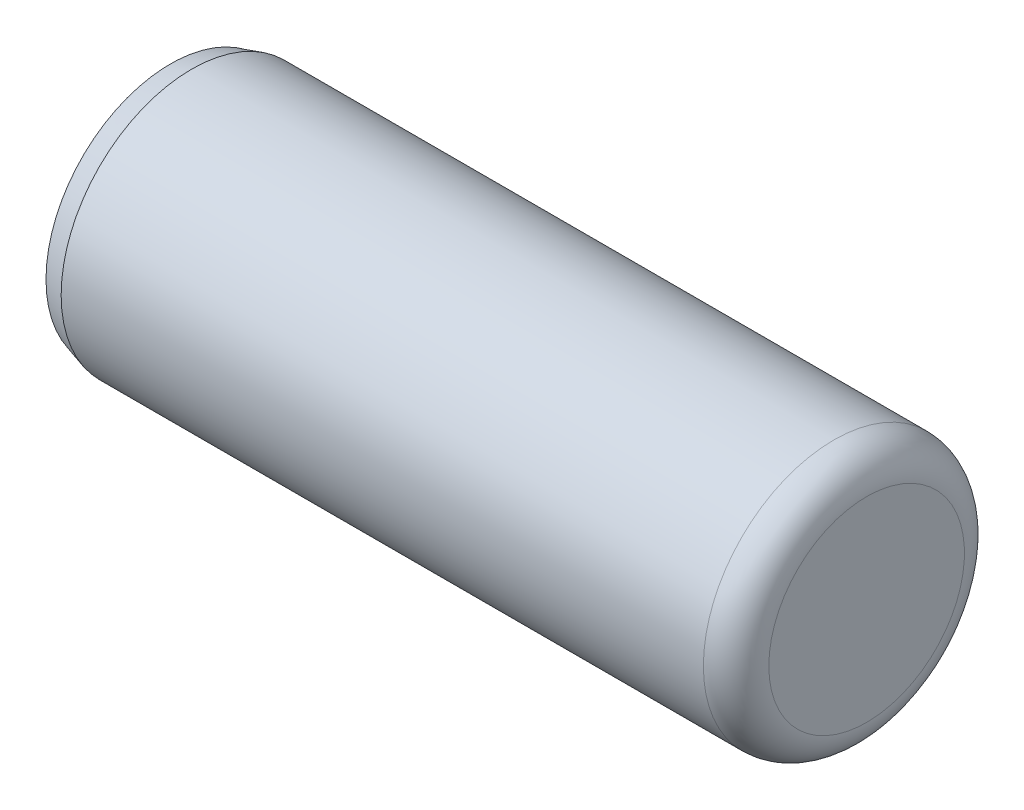
ISO-10303-21;
HEADER;
FILE_DESCRIPTION(('STEP AP214'),'2;1');
FILE_NAME('part.step','',(''),(''),'','','');
FILE_SCHEMA(('AUTOMOTIVE_DESIGN { 1 0 10303 214 1 1 1 1 }'));
ENDSEC;
DATA;
#1=APPLICATION_CONTEXT('core data for automotive mechanical design processes');
#2=APPLICATION_PROTOCOL_DEFINITION('international standard','automotive_design',2000,#1);
#3=PRODUCT_CONTEXT('',#1,'mechanical');
#4=PRODUCT('Part','Part','',(#3));
#5=PRODUCT_RELATED_PRODUCT_CATEGORY('part','',(#4));
#6=PRODUCT_DEFINITION_FORMATION('','',#4);
#7=PRODUCT_DEFINITION_CONTEXT('part definition',#1,'design');
#8=PRODUCT_DEFINITION('design','',#6,#7);
#9=PRODUCT_DEFINITION_SHAPE('','',#8);
#10=(LENGTH_UNIT() NAMED_UNIT(*) SI_UNIT(.MILLI.,.METRE.));
#11=(NAMED_UNIT(*) PLANE_ANGLE_UNIT() SI_UNIT($,.RADIAN.));
#12=(NAMED_UNIT(*) SI_UNIT($,.STERADIAN.) SOLID_ANGLE_UNIT());
#13=UNCERTAINTY_MEASURE_WITH_UNIT(LENGTH_MEASURE(1.E-05),#10,'distance_accuracy_value','');
#14=(GEOMETRIC_REPRESENTATION_CONTEXT(3) GLOBAL_UNCERTAINTY_ASSIGNED_CONTEXT((#13)) GLOBAL_UNIT_ASSIGNED_CONTEXT((#10,
#11,#12)) REPRESENTATION_CONTEXT('',''));
#15=CARTESIAN_POINT('',(0.,0.,0.));
#16=DIRECTION('',(0.,0.,1.));
#17=DIRECTION('',(1.,0.,0.));
#18=AXIS2_PLACEMENT_3D('',#15,#16,#17);
#19=CARTESIAN_POINT('',(11.5062,0.,0.));
#20=DIRECTION('',(-1.,0.,0.));
#21=DIRECTION('',(0.,0.,1.));
#22=AXIS2_PLACEMENT_3D('',#19,#20,#21);
#23=TOROIDAL_SURFACE('',#22,3.5687,1.1938);
#24=CARTESIAN_POINT('',(11.5062,0.,0.));
#25=DIRECTION('',(-1.,0.,0.));
#26=DIRECTION('',(0.,0.,1.));
#27=AXIS2_PLACEMENT_3D('',#24,#25,#26);
#28=CIRCLE('',#27,4.7625);
#29=CARTESIAN_POINT('',(11.5062,0.,4.7625));
#30=VERTEX_POINT('',#29);
#31=EDGE_CURVE('E10',#30,#30,#28,.T.);
#32=ORIENTED_EDGE('',*,*,#31,.F.);
#33=EDGE_LOOP('',(#32));
#34=FACE_BOUND('',#33,.T.);
#35=CARTESIAN_POINT('',(12.7,0.,0.));
#36=DIRECTION('',(-1.,0.,0.));
#37=DIRECTION('',(0.,0.,1.));
#38=AXIS2_PLACEMENT_3D('',#35,#36,#37);
#39=CIRCLE('',#38,3.5687);
#40=CARTESIAN_POINT('',(12.7,0.,3.5687));
#41=VERTEX_POINT('',#40);
#42=EDGE_CURVE('E53',#41,#41,#39,.T.);
#43=ORIENTED_EDGE('',*,*,#42,.T.);
#44=EDGE_LOOP('',(#43));
#45=FACE_BOUND('',#44,.T.);
#46=ADVANCED_FACE('F39',(#34,#45),#23,.T.);
#47=CARTESIAN_POINT('',(-12.7,0.,0.));
#48=DIRECTION('',(-1.,0.,0.));
#49=DIRECTION('',(0.,0.,1.));
#50=AXIS2_PLACEMENT_3D('',#47,#48,#49);
#51=CYLINDRICAL_SURFACE('',#50,4.7625);
#52=CARTESIAN_POINT('',(-11.9249221398564,0.,0.));
#53=DIRECTION('',(-1.,0.,0.));
#54=DIRECTION('',(0.,0.,1.));
#55=AXIS2_PLACEMENT_3D('',#52,#53,#54);
#56=CIRCLE('',#55,4.7625);
#57=CARTESIAN_POINT('',(-11.9249221398564,0.,4.7625));
#58=VERTEX_POINT('',#57);
#59=EDGE_CURVE('E45',#58,#58,#56,.T.);
#60=ORIENTED_EDGE('',*,*,#59,.F.);
#61=EDGE_LOOP('',(#60));
#62=FACE_BOUND('',#61,.T.);
#63=ORIENTED_EDGE('',*,*,#31,.T.);
#64=EDGE_LOOP('',(#63));
#65=FACE_BOUND('',#64,.T.);
#66=ADVANCED_FACE('F71',(#62,#65),#51,.T.);
#67=CARTESIAN_POINT('',(-11.9249221398564,0.,0.));
#68=DIRECTION('',(1.,0.,0.));
#69=DIRECTION('',(0.,0.,-1.));
#70=AXIS2_PLACEMENT_3D('',#67,#68,#69);
#71=CONICAL_SURFACE('',#70,4.7625,0.27925268031909);
#72=CARTESIAN_POINT('',(-12.7,0.,0.));
#73=DIRECTION('',(-1.,0.,0.));
#74=DIRECTION('',(0.,0.,1.));
#75=AXIS2_PLACEMENT_3D('',#72,#73,#74);
#76=CIRCLE('',#75,4.54025);
#77=CARTESIAN_POINT('',(-12.7,0.,4.54025));
#78=VERTEX_POINT('',#77);
#79=EDGE_CURVE('E49',#78,#78,#76,.T.);
#80=ORIENTED_EDGE('',*,*,#79,.F.);
#81=EDGE_LOOP('',(#80));
#82=FACE_BOUND('',#81,.T.);
#83=ORIENTED_EDGE('',*,*,#59,.T.);
#84=EDGE_LOOP('',(#83));
#85=FACE_BOUND('',#84,.T.);
#86=ADVANCED_FACE('F67',(#82,#85),#71,.T.);
#87=CARTESIAN_POINT('',(-12.7,4.54025,0.));
#88=DIRECTION('',(1.,0.,0.));
#89=DIRECTION('',(0.,0.,-1.));
#90=AXIS2_PLACEMENT_3D('',#87,#88,#89);
#91=PLANE('',#90);
#92=ORIENTED_EDGE('',*,*,#79,.T.);
#93=EDGE_LOOP('',(#92));
#94=FACE_BOUND('',#93,.T.);
#95=ADVANCED_FACE('F62',(#94),#91,.F.);
#96=CARTESIAN_POINT('',(12.7,3.5687,0.));
#97=DIRECTION('',(-1.,0.,0.));
#98=DIRECTION('',(0.,0.,1.));
#99=AXIS2_PLACEMENT_3D('',#96,#97,#98);
#100=PLANE('',#99);
#101=ORIENTED_EDGE('',*,*,#42,.F.);
#102=EDGE_LOOP('',(#101));
#103=FACE_BOUND('',#102,.T.);
#104=ADVANCED_FACE('F60',(#103),#100,.F.);
#105=CLOSED_SHELL('',(#46,#66,#86,#95,#104));
#106=MANIFOLD_SOLID_BREP('B2',#105);
#107=ADVANCED_BREP_SHAPE_REPRESENTATION('',(#18,#106),#14);
#108=SHAPE_DEFINITION_REPRESENTATION(#9,#107);
ENDSEC;
END-ISO-10303-21;
